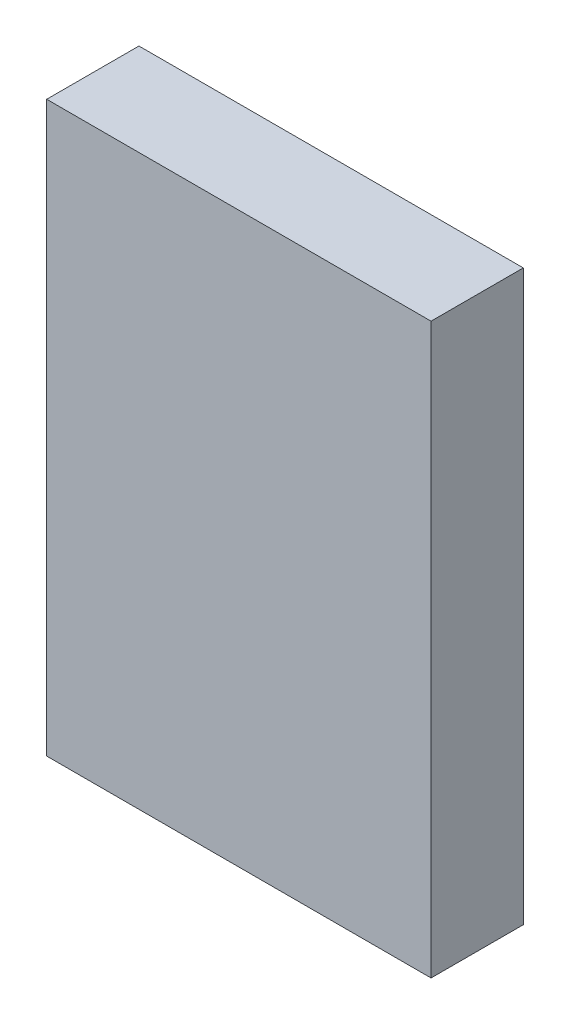
ISO-10303-21;
HEADER;
FILE_DESCRIPTION(('STEP AP214'),'2;1');
FILE_NAME('part.step','',(''),(''),'','','');
FILE_SCHEMA(('AUTOMOTIVE_DESIGN { 1 0 10303 214 1 1 1 1 }'));
ENDSEC;
DATA;
#1=APPLICATION_CONTEXT('core data for automotive mechanical design processes');
#2=APPLICATION_PROTOCOL_DEFINITION('international standard','automotive_design',2000,#1);
#3=PRODUCT_CONTEXT('',#1,'mechanical');
#4=PRODUCT('Part','Part','',(#3));
#5=PRODUCT_RELATED_PRODUCT_CATEGORY('part','',(#4));
#6=PRODUCT_DEFINITION_FORMATION('','',#4);
#7=PRODUCT_DEFINITION_CONTEXT('part definition',#1,'design');
#8=PRODUCT_DEFINITION('design','',#6,#7);
#9=PRODUCT_DEFINITION_SHAPE('','',#8);
#10=(LENGTH_UNIT() NAMED_UNIT(*) SI_UNIT(.MILLI.,.METRE.));
#11=(NAMED_UNIT(*) PLANE_ANGLE_UNIT() SI_UNIT($,.RADIAN.));
#12=(NAMED_UNIT(*) SI_UNIT($,.STERADIAN.) SOLID_ANGLE_UNIT());
#13=UNCERTAINTY_MEASURE_WITH_UNIT(LENGTH_MEASURE(1.E-05),#10,'distance_accuracy_value','');
#14=(GEOMETRIC_REPRESENTATION_CONTEXT(3) GLOBAL_UNCERTAINTY_ASSIGNED_CONTEXT((#13)) GLOBAL_UNIT_ASSIGNED_CONTEXT((#10,
#11,#12)) REPRESENTATION_CONTEXT('',''));
#15=CARTESIAN_POINT('',(0.,0.,0.));
#16=DIRECTION('',(0.,0.,1.));
#17=DIRECTION('',(1.,0.,0.));
#18=AXIS2_PLACEMENT_3D('',#15,#16,#17);
#19=CARTESIAN_POINT('',(0.62500002,0.92499942,0.0499999));
#20=DIRECTION('',(1.,0.,0.));
#21=DIRECTION('',(0.,-1.,0.));
#22=AXIS2_PLACEMENT_3D('',#19,#20,#21);
#23=PLANE('',#22);
#24=DIRECTION('',(0.,0.,1.));
#25=VECTOR('',#24,1.);
#26=CARTESIAN_POINT('',(0.62500002,0.92499942,0.0499999));
#27=LINE('',#26,#25);
#28=CARTESIAN_POINT('',(0.62500002,0.92499942,0.0499999));
#29=VERTEX_POINT('',#28);
#30=CARTESIAN_POINT('',(0.62500002,0.92499942,0.3499993));
#31=VERTEX_POINT('',#30);
#32=EDGE_CURVE('E11',#29,#31,#27,.T.);
#33=ORIENTED_EDGE('',*,*,#32,.T.);
#34=DIRECTION('',(0.,-1.,0.));
#35=VECTOR('',#34,1.);
#36=CARTESIAN_POINT('',(0.62500002,0.92499942,0.3499993));
#37=LINE('',#36,#35);
#38=CARTESIAN_POINT('',(0.62500002,-0.92499942,0.3499993));
#39=VERTEX_POINT('',#38);
#40=EDGE_CURVE('E23',#31,#39,#37,.T.);
#41=ORIENTED_EDGE('',*,*,#40,.T.);
#42=DIRECTION('',(0.,0.,1.));
#43=VECTOR('',#42,1.);
#44=CARTESIAN_POINT('',(0.62500002,-0.92499942,0.0499999));
#45=LINE('',#44,#43);
#46=CARTESIAN_POINT('',(0.62500002,-0.92499942,0.0499999));
#47=VERTEX_POINT('',#46);
#48=EDGE_CURVE('E83',#47,#39,#45,.T.);
#49=ORIENTED_EDGE('',*,*,#48,.F.);
#50=DIRECTION('',(0.,-1.,0.));
#51=VECTOR('',#50,1.);
#52=CARTESIAN_POINT('',(0.62500002,0.92499942,0.0499999));
#53=LINE('',#52,#51);
#54=EDGE_CURVE('E81',#29,#47,#53,.T.);
#55=ORIENTED_EDGE('',*,*,#54,.F.);
#56=EDGE_LOOP('',(#33,#41,#49,#55));
#57=FACE_BOUND('',#56,.T.);
#58=ADVANCED_FACE('F16',(#57),#23,.T.);
#59=CARTESIAN_POINT('',(0.62500002,-0.92499942,0.0499999));
#60=DIRECTION('',(0.,-1.,0.));
#61=DIRECTION('',(-1.,0.,0.));
#62=AXIS2_PLACEMENT_3D('',#59,#60,#61);
#63=PLANE('',#62);
#64=ORIENTED_EDGE('',*,*,#48,.T.);
#65=DIRECTION('',(-1.,0.,0.));
#66=VECTOR('',#65,1.);
#67=CARTESIAN_POINT('',(0.62500002,-0.92499942,0.3499993));
#68=LINE('',#67,#66);
#69=CARTESIAN_POINT('',(-0.62500002,-0.92499942,0.3499993));
#70=VERTEX_POINT('',#69);
#71=EDGE_CURVE('E78',#39,#70,#68,.T.);
#72=ORIENTED_EDGE('',*,*,#71,.T.);
#73=DIRECTION('',(0.,0.,1.));
#74=VECTOR('',#73,1.);
#75=CARTESIAN_POINT('',(-0.62500002,-0.92499942,0.0499999));
#76=LINE('',#75,#74);
#77=CARTESIAN_POINT('',(-0.62500002,-0.92499942,0.0499999));
#78=VERTEX_POINT('',#77);
#79=EDGE_CURVE('E76',#78,#70,#76,.T.);
#80=ORIENTED_EDGE('',*,*,#79,.F.);
#81=DIRECTION('',(-1.,0.,0.));
#82=VECTOR('',#81,1.);
#83=CARTESIAN_POINT('',(0.62500002,-0.92499942,0.0499999));
#84=LINE('',#83,#82);
#85=EDGE_CURVE('E61',#47,#78,#84,.T.);
#86=ORIENTED_EDGE('',*,*,#85,.F.);
#87=EDGE_LOOP('',(#64,#72,#80,#86));
#88=FACE_BOUND('',#87,.T.);
#89=ADVANCED_FACE('F90',(#88),#63,.T.);
#90=CARTESIAN_POINT('',(-0.62500002,-0.92499942,0.0499999));
#91=DIRECTION('',(-1.,0.,0.));
#92=DIRECTION('',(0.,1.,0.));
#93=AXIS2_PLACEMENT_3D('',#90,#91,#92);
#94=PLANE('',#93);
#95=ORIENTED_EDGE('',*,*,#79,.T.);
#96=DIRECTION('',(0.,1.,0.));
#97=VECTOR('',#96,1.);
#98=CARTESIAN_POINT('',(-0.62500002,-0.92499942,0.3499993));
#99=LINE('',#98,#97);
#100=CARTESIAN_POINT('',(-0.62500002,0.92499942,0.3499993));
#101=VERTEX_POINT('',#100);
#102=EDGE_CURVE('E67',#70,#101,#99,.T.);
#103=ORIENTED_EDGE('',*,*,#102,.T.);
#104=DIRECTION('',(0.,0.,1.));
#105=VECTOR('',#104,1.);
#106=CARTESIAN_POINT('',(-0.62500002,0.92499942,0.0499999));
#107=LINE('',#106,#105);
#108=CARTESIAN_POINT('',(-0.62500002,0.92499942,0.0499999));
#109=VERTEX_POINT('',#108);
#110=EDGE_CURVE('E63',#109,#101,#107,.T.);
#111=ORIENTED_EDGE('',*,*,#110,.F.);
#112=DIRECTION('',(0.,1.,0.));
#113=VECTOR('',#112,1.);
#114=CARTESIAN_POINT('',(-0.62500002,-0.92499942,0.0499999));
#115=LINE('',#114,#113);
#116=EDGE_CURVE('E57',#78,#109,#115,.T.);
#117=ORIENTED_EDGE('',*,*,#116,.F.);
#118=EDGE_LOOP('',(#95,#103,#111,#117));
#119=FACE_BOUND('',#118,.T.);
#120=ADVANCED_FACE('F65',(#119),#94,.T.);
#121=CARTESIAN_POINT('',(-0.62500002,0.92499942,0.0499999));
#122=DIRECTION('',(0.,1.,0.));
#123=DIRECTION('',(1.,0.,0.));
#124=AXIS2_PLACEMENT_3D('',#121,#122,#123);
#125=PLANE('',#124);
#126=ORIENTED_EDGE('',*,*,#110,.T.);
#127=DIRECTION('',(1.,0.,0.));
#128=VECTOR('',#127,1.);
#129=CARTESIAN_POINT('',(-0.62500002,0.92499942,0.3499993));
#130=LINE('',#129,#128);
#131=EDGE_CURVE('E30',#101,#31,#130,.T.);
#132=ORIENTED_EDGE('',*,*,#131,.T.);
#133=ORIENTED_EDGE('',*,*,#32,.F.);
#134=DIRECTION('',(1.,0.,0.));
#135=VECTOR('',#134,1.);
#136=CARTESIAN_POINT('',(-0.62500002,0.92499942,0.0499999));
#137=LINE('',#136,#135);
#138=EDGE_CURVE('E38',#109,#29,#137,.T.);
#139=ORIENTED_EDGE('',*,*,#138,.F.);
#140=EDGE_LOOP('',(#126,#132,#133,#139));
#141=FACE_BOUND('',#140,.T.);
#142=ADVANCED_FACE('F69',(#141),#125,.T.);
#143=CARTESIAN_POINT('',(0.,0.,0.0499999));
#144=DIRECTION('',(0.,0.,-1.));
#145=DIRECTION('',(-1.,0.,0.));
#146=AXIS2_PLACEMENT_3D('',#143,#144,#145);
#147=PLANE('',#146);
#148=ORIENTED_EDGE('',*,*,#54,.T.);
#149=ORIENTED_EDGE('',*,*,#85,.T.);
#150=ORIENTED_EDGE('',*,*,#116,.T.);
#151=ORIENTED_EDGE('',*,*,#138,.T.);
#152=EDGE_LOOP('',(#148,#149,#150,#151));
#153=FACE_BOUND('',#152,.T.);
#154=ADVANCED_FACE('F59',(#153),#147,.T.);
#155=CARTESIAN_POINT('',(0.,0.,0.3499993));
#156=DIRECTION('',(0.,0.,-1.));
#157=DIRECTION('',(-1.,0.,0.));
#158=AXIS2_PLACEMENT_3D('',#155,#156,#157);
#159=PLANE('',#158);
#160=ORIENTED_EDGE('',*,*,#131,.F.);
#161=ORIENTED_EDGE('',*,*,#102,.F.);
#162=ORIENTED_EDGE('',*,*,#71,.F.);
#163=ORIENTED_EDGE('',*,*,#40,.F.);
#164=EDGE_LOOP('',(#160,#161,#162,#163));
#165=FACE_BOUND('',#164,.T.);
#166=ADVANCED_FACE('F88',(#165),#159,.F.);
#167=CLOSED_SHELL('',(#58,#89,#120,#142,#154,#166));
#168=MANIFOLD_SOLID_BREP('B1',#167);
#169=ADVANCED_BREP_SHAPE_REPRESENTATION('',(#18,#168),#14);
#170=SHAPE_DEFINITION_REPRESENTATION(#9,#169);
ENDSEC;
END-ISO-10303-21;
